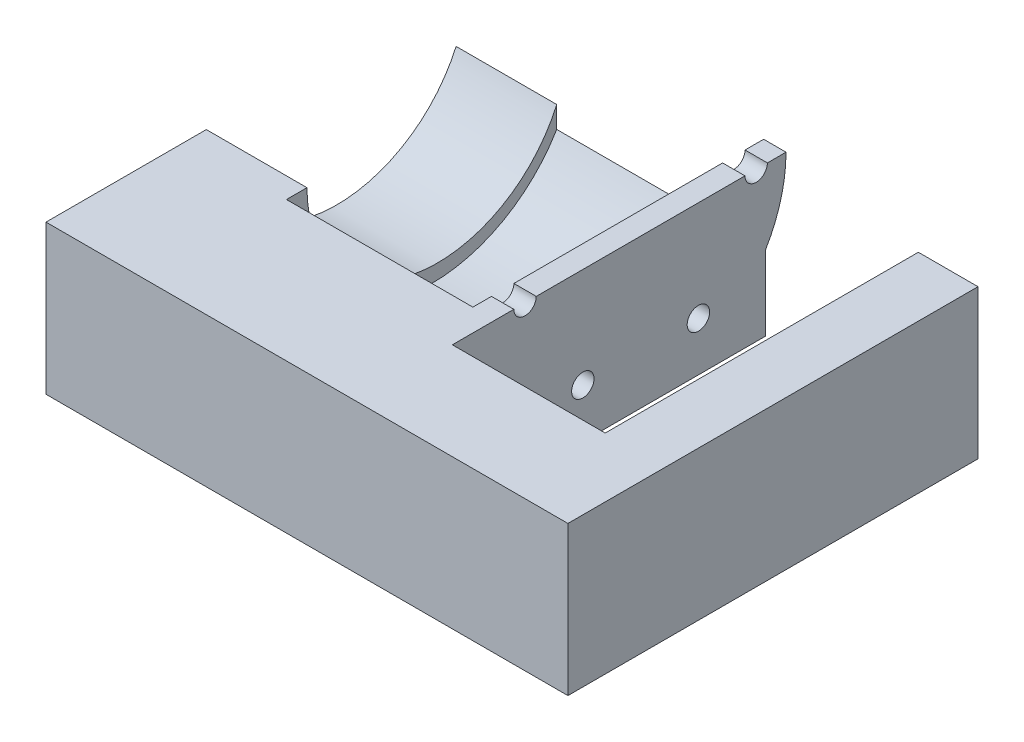
ISO-10303-21;
HEADER;
FILE_DESCRIPTION(('STEP AP214'),'2;1');
FILE_NAME('part.step','',(''),(''),'','','');
FILE_SCHEMA(('AUTOMOTIVE_DESIGN { 1 0 10303 214 1 1 1 1 }'));
ENDSEC;
DATA;
#1=APPLICATION_CONTEXT('core data for automotive mechanical design processes');
#2=APPLICATION_PROTOCOL_DEFINITION('international standard','automotive_design',2000,#1);
#3=PRODUCT_CONTEXT('',#1,'mechanical');
#4=PRODUCT('Part','Part','',(#3));
#5=PRODUCT_RELATED_PRODUCT_CATEGORY('part','',(#4));
#6=PRODUCT_DEFINITION_FORMATION('','',#4);
#7=PRODUCT_DEFINITION_CONTEXT('part definition',#1,'design');
#8=PRODUCT_DEFINITION('design','',#6,#7);
#9=PRODUCT_DEFINITION_SHAPE('','',#8);
#10=(LENGTH_UNIT() NAMED_UNIT(*) SI_UNIT(.MILLI.,.METRE.));
#11=(NAMED_UNIT(*) PLANE_ANGLE_UNIT() SI_UNIT($,.RADIAN.));
#12=(NAMED_UNIT(*) SI_UNIT($,.STERADIAN.) SOLID_ANGLE_UNIT());
#13=UNCERTAINTY_MEASURE_WITH_UNIT(LENGTH_MEASURE(1.E-05),#10,'distance_accuracy_value','');
#14=(GEOMETRIC_REPRESENTATION_CONTEXT(3) GLOBAL_UNCERTAINTY_ASSIGNED_CONTEXT((#13)) GLOBAL_UNIT_ASSIGNED_CONTEXT((#10,
#11,#12)) REPRESENTATION_CONTEXT('',''));
#15=CARTESIAN_POINT('',(0.,0.,0.));
#16=DIRECTION('',(0.,0.,1.));
#17=DIRECTION('',(1.,0.,0.));
#18=AXIS2_PLACEMENT_3D('',#15,#16,#17);
#19=CARTESIAN_POINT('',(96.6543289325505,20.,16.75));
#20=DIRECTION('',(-1.,0.,0.));
#21=DIRECTION('',(0.,0.,1.));
#22=AXIS2_PLACEMENT_3D('',#19,#20,#21);
#23=CYLINDRICAL_SURFACE('',#22,19.5);
#24=CARTESIAN_POINT('',(38.5,20.,16.75));
#25=DIRECTION('',(1.,0.,0.));
#26=DIRECTION('',(0.,0.,-1.));
#27=AXIS2_PLACEMENT_3D('',#24,#25,#26);
#28=CIRCLE('',#27,19.5);
#29=CARTESIAN_POINT('',(38.5,20.,36.25));
#30=VERTEX_POINT('',#29);
#31=CARTESIAN_POINT('',(38.5,10.015637226142,0.));
#32=VERTEX_POINT('',#31);
#33=EDGE_CURVE('E66',#30,#32,#28,.T.);
#34=ORIENTED_EDGE('',*,*,#33,.T.);
#35=DIRECTION('',(-1.,0.,0.));
#36=VECTOR('',#35,1.);
#37=CARTESIAN_POINT('',(96.6543289325505,10.015637226142,0.));
#38=LINE('',#37,#36);
#39=CARTESIAN_POINT('',(13.5,10.015637226142,0.));
#40=VERTEX_POINT('',#39);
#41=EDGE_CURVE('E214',#32,#40,#38,.T.);
#42=ORIENTED_EDGE('',*,*,#41,.T.);
#43=CARTESIAN_POINT('',(13.5,20.,16.75));
#44=DIRECTION('',(-1.,0.,0.));
#45=DIRECTION('',(0.,0.,1.));
#46=AXIS2_PLACEMENT_3D('',#43,#44,#45);
#47=CIRCLE('',#46,19.5);
#48=CARTESIAN_POINT('',(13.5,20.,36.25));
#49=VERTEX_POINT('',#48);
#50=EDGE_CURVE('E195',#40,#49,#47,.T.);
#51=ORIENTED_EDGE('',*,*,#50,.T.);
#52=DIRECTION('',(-1.,0.,0.));
#53=VECTOR('',#52,1.);
#54=CARTESIAN_POINT('',(96.6543289325505,20.,36.25));
#55=LINE('',#54,#53);
#56=EDGE_CURVE('E61',#49,#30,#55,.F.);
#57=ORIENTED_EDGE('',*,*,#56,.T.);
#58=EDGE_LOOP('',(#34,#42,#51,#57));
#59=FACE_BOUND('',#58,.T.);
#60=ADVANCED_FACE('F45',(#59),#23,.F.);
#61=CARTESIAN_POINT('',(0.,20.,0.));
#62=DIRECTION('',(0.,0.,-1.));
#63=DIRECTION('',(-1.,0.,0.));
#64=AXIS2_PLACEMENT_3D('',#61,#62,#63);
#65=PLANE('',#64);
#66=DIRECTION('',(0.,1.,0.));
#67=VECTOR('',#66,1.);
#68=CARTESIAN_POINT('',(13.5,20.,0.));
#69=LINE('',#68,#67);
#70=CARTESIAN_POINT('',(13.5,12.911276560621,0.));
#71=VERTEX_POINT('',#70);
#72=EDGE_CURVE('E209',#40,#71,#69,.T.);
#73=ORIENTED_EDGE('',*,*,#72,.F.);
#74=ORIENTED_EDGE('',*,*,#41,.F.);
#75=CARTESIAN_POINT('',(41.4999999999998,10.015637226142,0.));
#76=VERTEX_POINT('',#75);
#77=EDGE_CURVE('E215',#76,#32,#38,.T.);
#78=ORIENTED_EDGE('',*,*,#77,.F.);
#79=DIRECTION('',(0.,-1.,0.));
#80=VECTOR('',#79,1.);
#81=CARTESIAN_POINT('',(41.4999999999998,20.,0.));
#82=LINE('',#81,#80);
#83=CARTESIAN_POINT('',(41.4999999999998,0.,0.));
#84=VERTEX_POINT('',#83);
#85=EDGE_CURVE('E175',#76,#84,#82,.T.);
#86=ORIENTED_EDGE('',*,*,#85,.T.);
#87=DIRECTION('',(1.,0.,0.));
#88=VECTOR('',#87,1.);
#89=CARTESIAN_POINT('',(0.,0.,0.));
#90=LINE('',#89,#88);
#91=CARTESIAN_POINT('',(0.,0.,0.));
#92=VERTEX_POINT('',#91);
#93=EDGE_CURVE('E251',#92,#84,#90,.T.);
#94=ORIENTED_EDGE('',*,*,#93,.F.);
#95=DIRECTION('',(0.,-1.,0.));
#96=VECTOR('',#95,1.);
#97=CARTESIAN_POINT('',(0.,20.,0.));
#98=LINE('',#97,#96);
#99=CARTESIAN_POINT('',(0.,12.911276560621,0.));
#100=VERTEX_POINT('',#99);
#101=EDGE_CURVE('E261',#100,#92,#98,.T.);
#102=ORIENTED_EDGE('',*,*,#101,.F.);
#103=DIRECTION('',(-1.,0.,0.));
#104=VECTOR('',#103,1.);
#105=CARTESIAN_POINT('',(13.5,12.911276560621,0.));
#106=LINE('',#105,#104);
#107=EDGE_CURVE('E226',#71,#100,#106,.T.);
#108=ORIENTED_EDGE('',*,*,#107,.F.);
#109=EDGE_LOOP('',(#73,#74,#78,#86,#94,#102,#108));
#110=FACE_BOUND('',#109,.T.);
#111=ADVANCED_FACE('F308',(#110),#65,.T.);
#112=CARTESIAN_POINT('',(0.,20.,0.));
#113=DIRECTION('',(0.,1.,0.));
#114=DIRECTION('',(0.,0.,1.));
#115=AXIS2_PLACEMENT_3D('',#112,#113,#114);
#116=PLANE('',#115);
#117=DIRECTION('',(0.,0.,1.));
#118=VECTOR('',#117,1.);
#119=CARTESIAN_POINT('',(13.5,20.,0.));
#120=LINE('',#119,#118);
#121=CARTESIAN_POINT('',(13.5,20.,33.4999999999999));
#122=VERTEX_POINT('',#121);
#123=EDGE_CURVE('E200',#122,#49,#120,.T.);
#124=ORIENTED_EDGE('',*,*,#123,.F.);
#125=DIRECTION('',(-1.,0.,0.));
#126=VECTOR('',#125,1.);
#127=CARTESIAN_POINT('',(13.5,20.,33.4999999999999));
#128=LINE('',#127,#126);
#129=CARTESIAN_POINT('',(0.,20.,33.4999999999999));
#130=VERTEX_POINT('',#129);
#131=EDGE_CURVE('E222',#130,#122,#128,.F.);
#132=ORIENTED_EDGE('',*,*,#131,.F.);
#133=DIRECTION('',(0.,0.,1.));
#134=VECTOR('',#133,1.);
#135=CARTESIAN_POINT('',(0.,20.,0.));
#136=LINE('',#135,#134);
#137=CARTESIAN_POINT('',(0.,20.,54.9999999999999));
#138=VERTEX_POINT('',#137);
#139=EDGE_CURVE('E247',#130,#138,#136,.T.);
#140=ORIENTED_EDGE('',*,*,#139,.T.);
#141=DIRECTION('',(1.,0.,0.));
#142=VECTOR('',#141,1.);
#143=CARTESIAN_POINT('',(0.,20.,54.9999999999999));
#144=LINE('',#143,#142);
#145=CARTESIAN_POINT('',(69.9999999999998,20.,55.));
#146=VERTEX_POINT('',#145);
#147=EDGE_CURVE('E250',#138,#146,#144,.T.);
#148=ORIENTED_EDGE('',*,*,#147,.T.);
#149=DIRECTION('',(0.,0.,1.));
#150=VECTOR('',#149,1.);
#151=CARTESIAN_POINT('',(69.9999999999998,20.,0.));
#152=LINE('',#151,#150);
#153=CARTESIAN_POINT('',(69.9999999999998,20.,0.));
#154=VERTEX_POINT('',#153);
#155=EDGE_CURVE('E254',#154,#146,#152,.T.);
#156=ORIENTED_EDGE('',*,*,#155,.F.);
#157=DIRECTION('',(1.,0.,0.));
#158=VECTOR('',#157,1.);
#159=CARTESIAN_POINT('',(0.,20.,0.));
#160=LINE('',#159,#158);
#161=CARTESIAN_POINT('',(61.9999999999998,20.,0.));
#162=VERTEX_POINT('',#161);
#163=EDGE_CURVE('E258',#162,#154,#160,.T.);
#164=ORIENTED_EDGE('',*,*,#163,.F.);
#165=DIRECTION('',(0.,0.,-1.));
#166=VECTOR('',#165,1.);
#167=CARTESIAN_POINT('',(61.9999999999998,20.,0.));
#168=LINE('',#167,#166);
#169=CARTESIAN_POINT('',(61.9999999999998,20.,42.));
#170=VERTEX_POINT('',#169);
#171=EDGE_CURVE('E239',#170,#162,#168,.T.);
#172=ORIENTED_EDGE('',*,*,#171,.F.);
#173=DIRECTION('',(1.,0.,0.));
#174=VECTOR('',#173,1.);
#175=CARTESIAN_POINT('',(41.4999999999998,20.,42.));
#176=LINE('',#175,#174);
#177=CARTESIAN_POINT('',(41.4999999999998,20.,42.));
#178=VERTEX_POINT('',#177);
#179=EDGE_CURVE('E170',#178,#170,#176,.T.);
#180=ORIENTED_EDGE('',*,*,#179,.F.);
#181=DIRECTION('',(0.,0.,-1.));
#182=VECTOR('',#181,1.);
#183=CARTESIAN_POINT('',(41.4999999999998,20.,0.));
#184=LINE('',#183,#182);
#185=CARTESIAN_POINT('',(41.5,20.,33.7530816962821));
#186=VERTEX_POINT('',#185);
#187=EDGE_CURVE('E162',#178,#186,#184,.T.);
#188=ORIENTED_EDGE('',*,*,#187,.T.);
#189=DIRECTION('',(-1.,0.,0.));
#190=VECTOR('',#189,1.);
#191=CARTESIAN_POINT('',(41.5,20.,33.7530816962821));
#192=LINE('',#191,#190);
#193=CARTESIAN_POINT('',(38.5,20.,33.7530816962821));
#194=VERTEX_POINT('',#193);
#195=EDGE_CURVE('E167',#186,#194,#192,.T.);
#196=ORIENTED_EDGE('',*,*,#195,.T.);
#197=DIRECTION('',(0.,0.,1.));
#198=VECTOR('',#197,1.);
#199=CARTESIAN_POINT('',(38.5,20.,33.7530816962821));
#200=LINE('',#199,#198);
#201=EDGE_CURVE('E322',#194,#30,#200,.T.);
#202=ORIENTED_EDGE('',*,*,#201,.T.);
#203=ORIENTED_EDGE('',*,*,#56,.F.);
#204=EDGE_LOOP('',(#124,#132,#140,#148,#156,#164,#172,#180,#188,#196,#202,#203));
#205=FACE_BOUND('',#204,.T.);
#206=ADVANCED_FACE('F165',(#205),#116,.T.);
#207=CARTESIAN_POINT('',(0.,0.,0.));
#208=DIRECTION('',(0.,1.,0.));
#209=DIRECTION('',(0.,0.,1.));
#210=AXIS2_PLACEMENT_3D('',#207,#208,#209);
#211=PLANE('',#210);
#212=DIRECTION('',(0.,0.,-1.));
#213=VECTOR('',#212,1.);
#214=CARTESIAN_POINT('',(41.4999999999998,0.,0.));
#215=LINE('',#214,#213);
#216=CARTESIAN_POINT('',(41.4999999999998,0.,32.6132477258361));
#217=VERTEX_POINT('',#216);
#218=EDGE_CURVE('E54',#217,#84,#215,.T.);
#219=ORIENTED_EDGE('',*,*,#218,.F.);
#220=DIRECTION('',(1.,0.,0.));
#221=VECTOR('',#220,1.);
#222=CARTESIAN_POINT('',(41.4999999999998,0.,32.6132477258361));
#223=LINE('',#222,#221);
#224=CARTESIAN_POINT('',(61.9999999999998,0.,32.6132477258361));
#225=VERTEX_POINT('',#224);
#226=EDGE_CURVE('E294',#217,#225,#223,.T.);
#227=ORIENTED_EDGE('',*,*,#226,.T.);
#228=DIRECTION('',(0.,0.,-1.));
#229=VECTOR('',#228,1.);
#230=CARTESIAN_POINT('',(61.9999999999998,0.,0.));
#231=LINE('',#230,#229);
#232=CARTESIAN_POINT('',(61.9999999999998,0.,0.));
#233=VERTEX_POINT('',#232);
#234=EDGE_CURVE('E290',#225,#233,#231,.T.);
#235=ORIENTED_EDGE('',*,*,#234,.T.);
#236=CARTESIAN_POINT('',(69.9999999999998,0.,0.));
#237=VERTEX_POINT('',#236);
#238=EDGE_CURVE('E273',#233,#237,#90,.T.);
#239=ORIENTED_EDGE('',*,*,#238,.T.);
#240=DIRECTION('',(0.,0.,1.));
#241=VECTOR('',#240,1.);
#242=CARTESIAN_POINT('',(69.9999999999998,0.,0.));
#243=LINE('',#242,#241);
#244=CARTESIAN_POINT('',(69.9999999999998,0.,55.));
#245=VERTEX_POINT('',#244);
#246=EDGE_CURVE('E269',#237,#245,#243,.T.);
#247=ORIENTED_EDGE('',*,*,#246,.T.);
#248=DIRECTION('',(1.,0.,0.));
#249=VECTOR('',#248,1.);
#250=CARTESIAN_POINT('',(0.,0.,54.9999999999999));
#251=LINE('',#250,#249);
#252=CARTESIAN_POINT('',(0.,0.,54.9999999999999));
#253=VERTEX_POINT('',#252);
#254=EDGE_CURVE('E265',#253,#245,#251,.T.);
#255=ORIENTED_EDGE('',*,*,#254,.F.);
#256=DIRECTION('',(0.,0.,1.));
#257=VECTOR('',#256,1.);
#258=CARTESIAN_POINT('',(0.,0.,0.));
#259=LINE('',#258,#257);
#260=EDGE_CURVE('E246',#92,#253,#259,.T.);
#261=ORIENTED_EDGE('',*,*,#260,.F.);
#262=ORIENTED_EDGE('',*,*,#93,.T.);
#263=EDGE_LOOP('',(#219,#227,#235,#239,#247,#255,#261,#262));
#264=FACE_BOUND('',#263,.T.);
#265=ADVANCED_FACE('F304',(#264),#211,.F.);
#266=CARTESIAN_POINT('',(0.,20.,0.));
#267=DIRECTION('',(1.,0.,0.));
#268=DIRECTION('',(0.,0.,-1.));
#269=AXIS2_PLACEMENT_3D('',#266,#267,#268);
#270=PLANE('',#269);
#271=ORIENTED_EDGE('',*,*,#139,.F.);
#272=CARTESIAN_POINT('',(0.,20.,15.9999999999999));
#273=DIRECTION('',(1.,0.,0.));
#274=DIRECTION('',(0.,0.,-1.));
#275=AXIS2_PLACEMENT_3D('',#272,#273,#274);
#276=CIRCLE('',#275,17.5);
#277=EDGE_CURVE('E11',#130,#100,#276,.T.);
#278=ORIENTED_EDGE('',*,*,#277,.T.);
#279=ORIENTED_EDGE('',*,*,#101,.T.);
#280=ORIENTED_EDGE('',*,*,#260,.T.);
#281=DIRECTION('',(0.,-1.,0.));
#282=VECTOR('',#281,1.);
#283=CARTESIAN_POINT('',(0.,20.,54.9999999999999));
#284=LINE('',#283,#282);
#285=EDGE_CURVE('E286',#138,#253,#284,.T.);
#286=ORIENTED_EDGE('',*,*,#285,.F.);
#287=EDGE_LOOP('',(#271,#278,#279,#280,#286));
#288=FACE_BOUND('',#287,.T.);
#289=ADVANCED_FACE('F47',(#288),#270,.F.);
#290=CARTESIAN_POINT('',(0.,20.,54.9999999999999));
#291=DIRECTION('',(0.,0.,-1.));
#292=DIRECTION('',(-1.,0.,0.));
#293=AXIS2_PLACEMENT_3D('',#290,#291,#292);
#294=PLANE('',#293);
#295=ORIENTED_EDGE('',*,*,#254,.T.);
#296=DIRECTION('',(0.,-1.,0.));
#297=VECTOR('',#296,1.);
#298=CARTESIAN_POINT('',(69.9999999999998,20.,55.));
#299=LINE('',#298,#297);
#300=EDGE_CURVE('E283',#146,#245,#299,.T.);
#301=ORIENTED_EDGE('',*,*,#300,.F.);
#302=ORIENTED_EDGE('',*,*,#147,.F.);
#303=ORIENTED_EDGE('',*,*,#285,.T.);
#304=EDGE_LOOP('',(#295,#301,#302,#303));
#305=FACE_BOUND('',#304,.T.);
#306=ADVANCED_FACE('F421',(#305),#294,.F.);
#307=CARTESIAN_POINT('',(69.9999999999998,20.,0.));
#308=DIRECTION('',(1.,0.,0.));
#309=DIRECTION('',(0.,0.,-1.));
#310=AXIS2_PLACEMENT_3D('',#307,#308,#309);
#311=PLANE('',#310);
#312=ORIENTED_EDGE('',*,*,#246,.F.);
#313=DIRECTION('',(0.,-1.,0.));
#314=VECTOR('',#313,1.);
#315=CARTESIAN_POINT('',(69.9999999999998,20.,0.));
#316=LINE('',#315,#314);
#317=EDGE_CURVE('E279',#154,#237,#316,.T.);
#318=ORIENTED_EDGE('',*,*,#317,.F.);
#319=ORIENTED_EDGE('',*,*,#155,.T.);
#320=ORIENTED_EDGE('',*,*,#300,.T.);
#321=EDGE_LOOP('',(#312,#318,#319,#320));
#322=FACE_BOUND('',#321,.T.);
#323=ADVANCED_FACE('F418',(#322),#311,.T.);
#324=DIRECTION('',(0.,-1.,0.));
#325=VECTOR('',#324,1.);
#326=CARTESIAN_POINT('',(61.9999999999998,20.,0.));
#327=LINE('',#326,#325);
#328=EDGE_CURVE('E233',#162,#233,#327,.T.);
#329=ORIENTED_EDGE('',*,*,#328,.F.);
#330=ORIENTED_EDGE('',*,*,#163,.T.);
#331=ORIENTED_EDGE('',*,*,#317,.T.);
#332=ORIENTED_EDGE('',*,*,#238,.F.);
#333=EDGE_LOOP('',(#329,#330,#331,#332));
#334=FACE_BOUND('',#333,.T.);
#335=ADVANCED_FACE('F394',(#334),#65,.T.);
#336=CARTESIAN_POINT('',(41.4999999999998,20.,16.));
#337=DIRECTION('',(1.,0.,0.));
#338=DIRECTION('',(0.,0.,-1.));
#339=AXIS2_PLACEMENT_3D('',#336,#337,#338);
#340=CYLINDRICAL_SURFACE('',#339,26.);
#341=ORIENTED_EDGE('',*,*,#179,.T.);
#342=CARTESIAN_POINT('',(61.9999999999998,20.,16.));
#343=DIRECTION('',(1.,0.,0.));
#344=DIRECTION('',(0.,0.,-1.));
#345=AXIS2_PLACEMENT_3D('',#342,#343,#344);
#346=CIRCLE('',#345,26.);
#347=EDGE_CURVE('E229',#170,#225,#346,.T.);
#348=ORIENTED_EDGE('',*,*,#347,.T.);
#349=ORIENTED_EDGE('',*,*,#226,.F.);
#350=CARTESIAN_POINT('',(41.4999999999998,20.,16.));
#351=DIRECTION('',(1.,0.,0.));
#352=DIRECTION('',(0.,0.,-1.));
#353=AXIS2_PLACEMENT_3D('',#350,#351,#352);
#354=CIRCLE('',#353,26.);
#355=EDGE_CURVE('E230',#178,#217,#354,.T.);
#356=ORIENTED_EDGE('',*,*,#355,.F.);
#357=EDGE_LOOP('',(#341,#348,#349,#356));
#358=FACE_BOUND('',#357,.T.);
#359=ADVANCED_FACE('F406',(#358),#340,.F.);
#360=CARTESIAN_POINT('',(41.4999999999998,20.,16.));
#361=DIRECTION('',(1.,0.,0.));
#362=DIRECTION('',(0.,0.,-1.));
#363=AXIS2_PLACEMENT_3D('',#360,#361,#362);
#364=PLANE('',#363);
#365=ORIENTED_EDGE('',*,*,#85,.F.);
#366=CARTESIAN_POINT('',(41.5,20.,16.75));
#367=DIRECTION('',(1.,0.,0.));
#368=DIRECTION('',(0.,0.,-1.));
#369=AXIS2_PLACEMENT_3D('',#366,#367,#368);
#370=CIRCLE('',#369,19.5);
#371=CARTESIAN_POINT('',(41.5,20.,-2.75000000000004));
#372=VERTEX_POINT('',#371);
#373=EDGE_CURVE('E188',#76,#372,#370,.T.);
#374=ORIENTED_EDGE('',*,*,#373,.T.);
#375=DIRECTION('',(0.,0.,1.));
#376=VECTOR('',#375,1.);
#377=CARTESIAN_POINT('',(41.5,20.,-2.75000000000004));
#378=LINE('',#377,#376);
#379=CARTESIAN_POINT('',(41.5,20.,-0.253081696282165));
#380=VERTEX_POINT('',#379);
#381=EDGE_CURVE('E358',#372,#380,#378,.T.);
#382=ORIENTED_EDGE('',*,*,#381,.T.);
#383=CARTESIAN_POINT('',(41.5,20.,1.24999999999996));
#384=DIRECTION('',(-1.,0.,0.));
#385=DIRECTION('',(0.,0.,-1.));
#386=AXIS2_PLACEMENT_3D('',#383,#384,#385);
#387=CIRCLE('',#386,1.50308169628213);
#388=CARTESIAN_POINT('',(41.5,20.,2.75308169628209));
#389=VERTEX_POINT('',#388);
#390=EDGE_CURVE('E349',#380,#389,#387,.T.);
#391=ORIENTED_EDGE('',*,*,#390,.T.);
#392=DIRECTION('',(0.,0.,1.));
#393=VECTOR('',#392,1.);
#394=CARTESIAN_POINT('',(41.5,20.,2.75308169628209));
#395=LINE('',#394,#393);
#396=CARTESIAN_POINT('',(41.5,20.,30.7469183037178));
#397=VERTEX_POINT('',#396);
#398=EDGE_CURVE('E183',#389,#397,#395,.T.);
#399=ORIENTED_EDGE('',*,*,#398,.T.);
#400=CARTESIAN_POINT('',(41.5,20.0000000000001,32.25));
#401=DIRECTION('',(-1.,0.,0.));
#402=DIRECTION('',(0.,0.,-1.));
#403=AXIS2_PLACEMENT_3D('',#400,#401,#402);
#404=CIRCLE('',#403,1.50308169628212);
#405=EDGE_CURVE('E178',#397,#186,#404,.T.);
#406=ORIENTED_EDGE('',*,*,#405,.T.);
#407=ORIENTED_EDGE('',*,*,#187,.F.);
#408=ORIENTED_EDGE('',*,*,#355,.T.);
#409=ORIENTED_EDGE('',*,*,#218,.T.);
#410=EDGE_LOOP('',(#365,#374,#382,#391,#399,#406,#407,#408,#409));
#411=FACE_BOUND('',#410,.T.);
#412=CARTESIAN_POINT('',(41.5,6.57660624134119,9.));
#413=DIRECTION('',(1.,0.,0.));
#414=DIRECTION('',(0.,0.,-1.));
#415=AXIS2_PLACEMENT_3D('',#412,#413,#414);
#416=CIRCLE('',#415,1.50308169628213);
#417=CARTESIAN_POINT('',(41.5,6.57660624134119,7.49691830371787));
#418=VERTEX_POINT('',#417);
#419=EDGE_CURVE('E362',#418,#418,#416,.T.);
#420=ORIENTED_EDGE('',*,*,#419,.F.);
#421=EDGE_LOOP('',(#420));
#422=FACE_BOUND('',#421,.T.);
#423=CARTESIAN_POINT('',(41.5,6.57660624134124,24.5));
#424=DIRECTION('',(1.,0.,0.));
#425=DIRECTION('',(0.,0.,-1.));
#426=AXIS2_PLACEMENT_3D('',#423,#424,#425);
#427=CIRCLE('',#426,1.50308169628213);
#428=CARTESIAN_POINT('',(41.5,6.57660624134124,22.9969183037179));
#429=VERTEX_POINT('',#428);
#430=EDGE_CURVE('E371',#429,#429,#427,.T.);
#431=ORIENTED_EDGE('',*,*,#430,.F.);
#432=EDGE_LOOP('',(#431));
#433=FACE_BOUND('',#432,.T.);
#434=ADVANCED_FACE('F180',(#411,#422,#433),#364,.T.);
#435=CARTESIAN_POINT('',(61.9999999999998,20.,16.));
#436=DIRECTION('',(1.,0.,0.));
#437=DIRECTION('',(0.,0.,-1.));
#438=AXIS2_PLACEMENT_3D('',#435,#436,#437);
#439=PLANE('',#438);
#440=ORIENTED_EDGE('',*,*,#171,.T.);
#441=ORIENTED_EDGE('',*,*,#328,.T.);
#442=ORIENTED_EDGE('',*,*,#234,.F.);
#443=ORIENTED_EDGE('',*,*,#347,.F.);
#444=EDGE_LOOP('',(#440,#441,#442,#443));
#445=FACE_BOUND('',#444,.T.);
#446=ADVANCED_FACE('F402',(#445),#439,.F.);
#447=CARTESIAN_POINT('',(13.5,20.,15.9999999999999));
#448=DIRECTION('',(-1.,0.,0.));
#449=DIRECTION('',(0.,0.,1.));
#450=AXIS2_PLACEMENT_3D('',#447,#448,#449);
#451=CYLINDRICAL_SURFACE('',#450,17.5);
#452=ORIENTED_EDGE('',*,*,#107,.T.);
#453=ORIENTED_EDGE('',*,*,#277,.F.);
#454=ORIENTED_EDGE('',*,*,#131,.T.);
#455=CARTESIAN_POINT('',(13.5,20.,15.9999999999999));
#456=DIRECTION('',(-1.,0.,0.));
#457=DIRECTION('',(0.,0.,1.));
#458=AXIS2_PLACEMENT_3D('',#455,#456,#457);
#459=CIRCLE('',#458,17.5);
#460=EDGE_CURVE('E219',#71,#122,#459,.T.);
#461=ORIENTED_EDGE('',*,*,#460,.F.);
#462=EDGE_LOOP('',(#452,#453,#454,#461));
#463=FACE_BOUND('',#462,.T.);
#464=ADVANCED_FACE('F399',(#463),#451,.F.);
#465=CARTESIAN_POINT('',(13.5,20.,16.75));
#466=DIRECTION('',(-1.,0.,0.));
#467=DIRECTION('',(0.,0.,1.));
#468=AXIS2_PLACEMENT_3D('',#465,#466,#467);
#469=PLANE('',#468);
#470=ORIENTED_EDGE('',*,*,#72,.T.);
#471=ORIENTED_EDGE('',*,*,#460,.T.);
#472=ORIENTED_EDGE('',*,*,#123,.T.);
#473=ORIENTED_EDGE('',*,*,#50,.F.);
#474=EDGE_LOOP('',(#470,#471,#472,#473));
#475=FACE_BOUND('',#474,.T.);
#476=ADVANCED_FACE('F397',(#475),#469,.F.);
#477=CARTESIAN_POINT('',(38.5,20.0000000000001,32.25));
#478=DIRECTION('',(1.,0.,0.));
#479=DIRECTION('',(0.,0.,-1.));
#480=AXIS2_PLACEMENT_3D('',#477,#478,#479);
#481=PLANE('',#480);
#482=CARTESIAN_POINT('',(38.5,20.0000000000001,32.25));
#483=DIRECTION('',(-1.,0.,0.));
#484=DIRECTION('',(0.,0.,-1.));
#485=AXIS2_PLACEMENT_3D('',#482,#483,#484);
#486=CIRCLE('',#485,1.50308169628212);
#487=CARTESIAN_POINT('',(38.5,20.,30.7469183037178));
#488=VERTEX_POINT('',#487);
#489=EDGE_CURVE('E193',#488,#194,#486,.T.);
#490=ORIENTED_EDGE('',*,*,#489,.F.);
#491=DIRECTION('',(0.,0.,1.));
#492=VECTOR('',#491,1.);
#493=CARTESIAN_POINT('',(38.5,20.,2.75308169628209));
#494=LINE('',#493,#492);
#495=CARTESIAN_POINT('',(38.5,20.,2.75308169628209));
#496=VERTEX_POINT('',#495);
#497=EDGE_CURVE('E189',#496,#488,#494,.T.);
#498=ORIENTED_EDGE('',*,*,#497,.F.);
#499=CARTESIAN_POINT('',(38.5,20.,1.24999999999996));
#500=DIRECTION('',(-1.,0.,0.));
#501=DIRECTION('',(0.,0.,-1.));
#502=AXIS2_PLACEMENT_3D('',#499,#500,#501);
#503=CIRCLE('',#502,1.50308169628213);
#504=CARTESIAN_POINT('',(38.5,20.,-0.253081696282165));
#505=VERTEX_POINT('',#504);
#506=EDGE_CURVE('E331',#505,#496,#503,.T.);
#507=ORIENTED_EDGE('',*,*,#506,.F.);
#508=DIRECTION('',(0.,0.,1.));
#509=VECTOR('',#508,1.);
#510=CARTESIAN_POINT('',(38.5,20.,-2.75000000000004));
#511=LINE('',#510,#509);
#512=CARTESIAN_POINT('',(38.5,20.,-2.75000000000004));
#513=VERTEX_POINT('',#512);
#514=EDGE_CURVE('E320',#513,#505,#511,.T.);
#515=ORIENTED_EDGE('',*,*,#514,.F.);
#516=EDGE_CURVE('E314',#32,#513,#28,.T.);
#517=ORIENTED_EDGE('',*,*,#516,.F.);
#518=ORIENTED_EDGE('',*,*,#33,.F.);
#519=ORIENTED_EDGE('',*,*,#201,.F.);
#520=EDGE_LOOP('',(#490,#498,#507,#515,#517,#518,#519));
#521=FACE_BOUND('',#520,.T.);
#522=CARTESIAN_POINT('',(38.5,6.57660624134119,9.));
#523=DIRECTION('',(1.,0.,0.));
#524=DIRECTION('',(0.,0.,-1.));
#525=AXIS2_PLACEMENT_3D('',#522,#523,#524);
#526=CIRCLE('',#525,1.50308169628213);
#527=CARTESIAN_POINT('',(38.5,6.57660624134119,7.49691830371787));
#528=VERTEX_POINT('',#527);
#529=EDGE_CURVE('E365',#528,#528,#526,.T.);
#530=ORIENTED_EDGE('',*,*,#529,.T.);
#531=EDGE_LOOP('',(#530));
#532=FACE_BOUND('',#531,.T.);
#533=CARTESIAN_POINT('',(38.5,6.57660624134124,24.5));
#534=DIRECTION('',(1.,0.,0.));
#535=DIRECTION('',(0.,0.,-1.));
#536=AXIS2_PLACEMENT_3D('',#533,#534,#535);
#537=CIRCLE('',#536,1.50308169628213);
#538=CARTESIAN_POINT('',(38.5,6.57660624134124,22.9969183037179));
#539=VERTEX_POINT('',#538);
#540=EDGE_CURVE('E374',#539,#539,#537,.T.);
#541=ORIENTED_EDGE('',*,*,#540,.T.);
#542=EDGE_LOOP('',(#541));
#543=FACE_BOUND('',#542,.T.);
#544=ADVANCED_FACE('F317',(#521,#532,#543),#481,.F.);
#545=CARTESIAN_POINT('',(41.5,20.0000000000001,32.25));
#546=DIRECTION('',(-1.,0.,0.));
#547=DIRECTION('',(0.,0.,1.));
#548=AXIS2_PLACEMENT_3D('',#545,#546,#547);
#549=CYLINDRICAL_SURFACE('',#548,1.50308169628212);
#550=ORIENTED_EDGE('',*,*,#489,.T.);
#551=ORIENTED_EDGE('',*,*,#195,.F.);
#552=ORIENTED_EDGE('',*,*,#405,.F.);
#553=DIRECTION('',(-1.,0.,0.));
#554=VECTOR('',#553,1.);
#555=CARTESIAN_POINT('',(41.5,20.,30.7469183037178));
#556=LINE('',#555,#554);
#557=EDGE_CURVE('E336',#397,#488,#556,.T.);
#558=ORIENTED_EDGE('',*,*,#557,.T.);
#559=EDGE_LOOP('',(#550,#551,#552,#558));
#560=FACE_BOUND('',#559,.T.);
#561=ADVANCED_FACE('F191',(#560),#549,.F.);
#562=CARTESIAN_POINT('',(41.5,20.,16.75));
#563=DIRECTION('',(-1.,0.,0.));
#564=DIRECTION('',(0.,0.,1.));
#565=AXIS2_PLACEMENT_3D('',#562,#563,#564);
#566=CYLINDRICAL_SURFACE('',#565,19.5);
#567=ORIENTED_EDGE('',*,*,#77,.T.);
#568=ORIENTED_EDGE('',*,*,#516,.T.);
#569=DIRECTION('',(-1.,0.,0.));
#570=VECTOR('',#569,1.);
#571=CARTESIAN_POINT('',(41.5,20.,-2.75000000000004));
#572=LINE('',#571,#570);
#573=EDGE_CURVE('E196',#372,#513,#572,.T.);
#574=ORIENTED_EDGE('',*,*,#573,.F.);
#575=ORIENTED_EDGE('',*,*,#373,.F.);
#576=EDGE_LOOP('',(#567,#568,#574,#575));
#577=FACE_BOUND('',#576,.T.);
#578=ADVANCED_FACE('F312',(#577),#566,.T.);
#579=CARTESIAN_POINT('',(41.5,20.,-2.75000000000004));
#580=DIRECTION('',(0.,-1.,0.));
#581=DIRECTION('',(0.,0.,-1.));
#582=AXIS2_PLACEMENT_3D('',#579,#580,#581);
#583=PLANE('',#582);
#584=ORIENTED_EDGE('',*,*,#514,.T.);
#585=DIRECTION('',(-1.,0.,0.));
#586=VECTOR('',#585,1.);
#587=CARTESIAN_POINT('',(41.5,20.,-0.253081696282165));
#588=LINE('',#587,#586);
#589=EDGE_CURVE('E203',#380,#505,#588,.T.);
#590=ORIENTED_EDGE('',*,*,#589,.F.);
#591=ORIENTED_EDGE('',*,*,#381,.F.);
#592=ORIENTED_EDGE('',*,*,#573,.T.);
#593=EDGE_LOOP('',(#584,#590,#591,#592));
#594=FACE_BOUND('',#593,.T.);
#595=ADVANCED_FACE('F379',(#594),#583,.F.);
#596=CARTESIAN_POINT('',(41.5,20.,1.24999999999996));
#597=DIRECTION('',(-1.,0.,0.));
#598=DIRECTION('',(0.,0.,1.));
#599=AXIS2_PLACEMENT_3D('',#596,#597,#598);
#600=CYLINDRICAL_SURFACE('',#599,1.50308169628213);
#601=ORIENTED_EDGE('',*,*,#506,.T.);
#602=DIRECTION('',(-1.,0.,0.));
#603=VECTOR('',#602,1.);
#604=CARTESIAN_POINT('',(41.5,20.,2.75308169628209));
#605=LINE('',#604,#603);
#606=EDGE_CURVE('E339',#389,#496,#605,.T.);
#607=ORIENTED_EDGE('',*,*,#606,.F.);
#608=ORIENTED_EDGE('',*,*,#390,.F.);
#609=ORIENTED_EDGE('',*,*,#589,.T.);
#610=EDGE_LOOP('',(#601,#607,#608,#609));
#611=FACE_BOUND('',#610,.T.);
#612=ADVANCED_FACE('F347',(#611),#600,.F.);
#613=CARTESIAN_POINT('',(41.5,20.,2.75308169628209));
#614=DIRECTION('',(0.,-1.,0.));
#615=DIRECTION('',(0.,0.,-1.));
#616=AXIS2_PLACEMENT_3D('',#613,#614,#615);
#617=PLANE('',#616);
#618=ORIENTED_EDGE('',*,*,#497,.T.);
#619=ORIENTED_EDGE('',*,*,#557,.F.);
#620=ORIENTED_EDGE('',*,*,#398,.F.);
#621=ORIENTED_EDGE('',*,*,#606,.T.);
#622=EDGE_LOOP('',(#618,#619,#620,#621));
#623=FACE_BOUND('',#622,.T.);
#624=ADVANCED_FACE('F354',(#623),#617,.F.);
#625=CARTESIAN_POINT('',(41.5,6.57660624134119,9.));
#626=DIRECTION('',(-1.,0.,0.));
#627=DIRECTION('',(0.,0.,1.));
#628=AXIS2_PLACEMENT_3D('',#625,#626,#627);
#629=CYLINDRICAL_SURFACE('',#628,1.50308169628213);
#630=ORIENTED_EDGE('',*,*,#419,.T.);
#631=EDGE_LOOP('',(#630));
#632=FACE_BOUND('',#631,.T.);
#633=ORIENTED_EDGE('',*,*,#529,.F.);
#634=EDGE_LOOP('',(#633));
#635=FACE_BOUND('',#634,.T.);
#636=ADVANCED_FACE('F454',(#632,#635),#629,.F.);
#637=CARTESIAN_POINT('',(41.5,6.57660624134124,24.5));
#638=DIRECTION('',(-1.,0.,0.));
#639=DIRECTION('',(0.,0.,1.));
#640=AXIS2_PLACEMENT_3D('',#637,#638,#639);
#641=CYLINDRICAL_SURFACE('',#640,1.50308169628213);
#642=ORIENTED_EDGE('',*,*,#430,.T.);
#643=EDGE_LOOP('',(#642));
#644=FACE_BOUND('',#643,.T.);
#645=ORIENTED_EDGE('',*,*,#540,.F.);
#646=EDGE_LOOP('',(#645));
#647=FACE_BOUND('',#646,.T.);
#648=ADVANCED_FACE('F460',(#644,#647),#641,.F.);
#649=CLOSED_SHELL('',(#60,#111,#206,#265,#289,#306,#323,#335,#359,#434,#446,#464,#476,#544,#561,
#578,#595,#612,#624,#636,#648));
#650=MANIFOLD_SOLID_BREP('B2',#649);
#651=ADVANCED_BREP_SHAPE_REPRESENTATION('',(#18,#650),#14);
#652=SHAPE_DEFINITION_REPRESENTATION(#9,#651);
ENDSEC;
END-ISO-10303-21;
